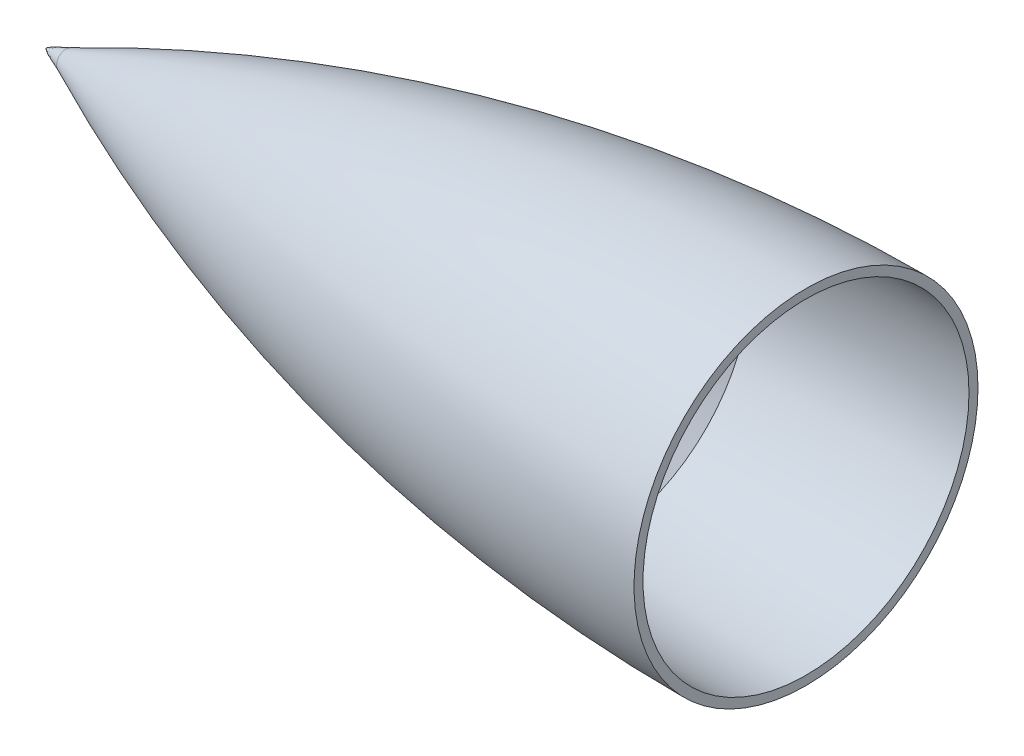
ISO-10303-21;
HEADER;
FILE_DESCRIPTION(('STEP AP214'),'2;1');
FILE_NAME('part.step','',(''),(''),'','','');
FILE_SCHEMA(('AUTOMOTIVE_DESIGN { 1 0 10303 214 1 1 1 1 }'));
ENDSEC;
DATA;
#1=APPLICATION_CONTEXT('core data for automotive mechanical design processes');
#2=APPLICATION_PROTOCOL_DEFINITION('international standard','automotive_design',2000,#1);
#3=PRODUCT_CONTEXT('',#1,'mechanical');
#4=PRODUCT('Part','Part','',(#3));
#5=PRODUCT_RELATED_PRODUCT_CATEGORY('part','',(#4));
#6=PRODUCT_DEFINITION_FORMATION('','',#4);
#7=PRODUCT_DEFINITION_CONTEXT('part definition',#1,'design');
#8=PRODUCT_DEFINITION('design','',#6,#7);
#9=PRODUCT_DEFINITION_SHAPE('','',#8);
#10=(LENGTH_UNIT() NAMED_UNIT(*) SI_UNIT(.MILLI.,.METRE.));
#11=(NAMED_UNIT(*) PLANE_ANGLE_UNIT() SI_UNIT($,.RADIAN.));
#12=(NAMED_UNIT(*) SI_UNIT($,.STERADIAN.) SOLID_ANGLE_UNIT());
#13=UNCERTAINTY_MEASURE_WITH_UNIT(LENGTH_MEASURE(1.E-05),#10,'distance_accuracy_value','');
#14=(GEOMETRIC_REPRESENTATION_CONTEXT(3) GLOBAL_UNCERTAINTY_ASSIGNED_CONTEXT((#13)) GLOBAL_UNIT_ASSIGNED_CONTEXT((#10,
#11,#12)) REPRESENTATION_CONTEXT('',''));
#15=CARTESIAN_POINT('',(0.,0.,0.));
#16=DIRECTION('',(0.,0.,1.));
#17=DIRECTION('',(1.,0.,0.));
#18=AXIS2_PLACEMENT_3D('',#15,#16,#17);
#19=CARTESIAN_POINT('',(0.,398.267441860465,0.));
#20=DIRECTION('',(1.,0.,0.));
#21=DIRECTION('',(0.,0.,-1.));
#22=AXIS2_PLACEMENT_3D('',#19,#20,#21);
#23=DEGENERATE_TOROIDAL_SURFACE('',#22,398.267441860465,441.267441860465,.F.);
#24=CARTESIAN_POINT('',(0.,398.267441860465,0.));
#25=DIRECTION('',(1.,0.,0.));
#26=DIRECTION('',(0.,0.,-1.));
#27=AXIS2_PLACEMENT_3D('',#24,#25,#26);
#28=CIRCLE('',#27,43.);
#29=CARTESIAN_POINT('',(0.,398.267441860465,-43.));
#30=VERTEX_POINT('',#29);
#31=EDGE_CURVE('E63',#30,#30,#28,.T.);
#32=ORIENTED_EDGE('',*,*,#31,.F.);
#33=EDGE_LOOP('',(#32));
#34=FACE_BOUND('',#33,.T.);
#35=CARTESIAN_POINT('',(-185.,398.267441860465,0.));
#36=DIRECTION('',(-1.,0.,0.));
#37=DIRECTION('',(0.,-1.,0.));
#38=AXIS2_PLACEMENT_3D('',#35,#36,#37);
#39=CIRCLE('',#38,2.34703022720045);
#40=CARTESIAN_POINT('',(-185.,395.920411633264,0.));
#41=VERTEX_POINT('',#40);
#42=EDGE_CURVE('E61',#41,#41,#39,.T.);
#43=ORIENTED_EDGE('',*,*,#42,.F.);
#44=EDGE_LOOP('',(#43));
#45=FACE_BOUND('',#44,.T.);
#46=ADVANCED_FACE('F41',(#34,#45),#23,.F.);
#47=CARTESIAN_POINT('',(0.,398.267441860465,398.267441860465));
#48=DIRECTION('',(0.,-1.,0.));
#49=DIRECTION('',(0.,0.,-1.));
#50=AXIS2_PLACEMENT_3D('',#47,#48,#49);
#51=CIRCLE('',#50,436.267441860465);
#52=TRIMMED_CURVE('',#51,(PARAMETER_VALUE(-0.420469330632792)),
(PARAMETER_VALUE(0.420469330632792)),.T.,.PARAMETER.);
#53=CARTESIAN_POINT('',(0.,398.267441860465,0.));
#54=DIRECTION('',(1.,0.,0.));
#55=AXIS1_PLACEMENT('',#53,#54);
#56=SURFACE_OF_REVOLUTION('',#52,#55);
#57=CARTESIAN_POINT('',(-54.8722186320111,398.267441860465,0.));
#58=DIRECTION('',(1.,0.,0.));
#59=DIRECTION('',(0.,0.,-1.));
#60=AXIS2_PLACEMENT_3D('',#57,#58,#59);
#61=CIRCLE('',#60,34.5354237144697);
#62=CARTESIAN_POINT('',(-54.8722186320111,398.267441860465,-34.5354237144697));
#63=VERTEX_POINT('',#62);
#64=EDGE_CURVE('E11',#63,#63,#61,.T.);
#65=ORIENTED_EDGE('',*,*,#64,.T.);
#66=EDGE_LOOP('',(#65));
#67=FACE_BOUND('',#66,.T.);
#68=CARTESIAN_POINT('',(-178.079548464711,398.267441860465,0.));
#69=VERTEX_POINT('',#68);
#70=VERTEX_LOOP('',#69);
#71=FACE_BOUND('',#70,.T.);
#72=ADVANCED_FACE('F90',(#67,#71),#56,.F.);
#73=CARTESIAN_POINT('',(-54.8722186320111,398.267441860465,0.));
#74=DIRECTION('',(1.,0.,0.));
#75=DIRECTION('',(0.,0.,-1.));
#76=AXIS2_PLACEMENT_3D('',#73,#74,#75);
#77=CONICAL_SURFACE('',#76,34.5354237144697,0.785398163397422);
#78=CARTESIAN_POINT('',(-51.7141177383253,398.267441860465,0.));
#79=DIRECTION('',(1.,0.,0.));
#80=DIRECTION('',(0.,0.,-1.));
#81=AXIS2_PLACEMENT_3D('',#78,#79,#80);
#82=CIRCLE('',#81,37.6935246081553);
#83=CARTESIAN_POINT('',(-51.7141177383253,398.267441860465,-37.6935246081553));
#84=VERTEX_POINT('',#83);
#85=EDGE_CURVE('E48',#84,#84,#82,.T.);
#86=ORIENTED_EDGE('',*,*,#85,.T.);
#87=EDGE_LOOP('',(#86));
#88=FACE_BOUND('',#87,.T.);
#89=ORIENTED_EDGE('',*,*,#64,.F.);
#90=EDGE_LOOP('',(#89));
#91=FACE_BOUND('',#90,.T.);
#92=ADVANCED_FACE('F77',(#88,#91),#77,.F.);
#93=CARTESIAN_POINT('',(0.,398.267441860465,0.));
#94=DIRECTION('',(1.,0.,0.));
#95=DIRECTION('',(0.,0.,-1.));
#96=AXIS2_PLACEMENT_3D('',#93,#94,#95);
#97=DEGENERATE_TOROIDAL_SURFACE('',#96,398.267441860465,439.017441860465,.F.);
#98=CARTESIAN_POINT('',(0.,398.267441860465,0.));
#99=DIRECTION('',(1.,0.,0.));
#100=DIRECTION('',(0.,0.,-1.));
#101=AXIS2_PLACEMENT_3D('',#98,#99,#100);
#102=CIRCLE('',#101,40.7500000000001);
#103=CARTESIAN_POINT('',(0.,398.267441860465,-40.7500000000001));
#104=VERTEX_POINT('',#103);
#105=EDGE_CURVE('E66',#104,#104,#102,.T.);
#106=ORIENTED_EDGE('',*,*,#105,.T.);
#107=EDGE_LOOP('',(#106));
#108=FACE_BOUND('',#107,.T.);
#109=ORIENTED_EDGE('',*,*,#85,.F.);
#110=EDGE_LOOP('',(#109));
#111=FACE_BOUND('',#110,.T.);
#112=ADVANCED_FACE('F80',(#108,#111),#97,.T.);
#113=CARTESIAN_POINT('',(0.,441.267441860465,0.));
#114=DIRECTION('',(1.,0.,0.));
#115=DIRECTION('',(0.,0.,-1.));
#116=AXIS2_PLACEMENT_3D('',#113,#114,#115);
#117=PLANE('',#116);
#118=ORIENTED_EDGE('',*,*,#31,.T.);
#119=EDGE_LOOP('',(#118));
#120=FACE_BOUND('',#119,.T.);
#121=ORIENTED_EDGE('',*,*,#105,.F.);
#122=EDGE_LOOP('',(#121));
#123=FACE_BOUND('',#122,.T.);
#124=ADVANCED_FACE('F57',(#120,#123),#117,.T.);
#125=CARTESIAN_POINT('',(-185.,400.614472087665,0.));
#126=CARTESIAN_POINT('',(-186.994315070824,399.772437375157,0.));
#127=CARTESIAN_POINT('',(-189.334509224748,399.05906875814,0.));
#128=CARTESIAN_POINT('',(-189.991001922598,398.267441860465,0.));
#129=B_SPLINE_CURVE_WITH_KNOTS('',3,(#125,#126,#127,#128),.UNSPECIFIED.,.F.,.F.,(4,4),(0.,1.),.UNSPECIFIED.);
#130=CARTESIAN_POINT('',(-185.,398.267441860465,0.));
#131=DIRECTION('',(1.,0.,0.));
#132=AXIS1_PLACEMENT('',#130,#131);
#133=SURFACE_OF_REVOLUTION('',#129,#132);
#134=CARTESIAN_POINT('',(-189.991001922598,398.267441860465,0.));
#135=VERTEX_POINT('',#134);
#136=VERTEX_LOOP('',#135);
#137=FACE_BOUND('',#136,.T.);
#138=ORIENTED_EDGE('',*,*,#42,.T.);
#139=EDGE_LOOP('',(#138));
#140=FACE_BOUND('',#139,.T.);
#141=ADVANCED_FACE('F54',(#137,#140),#133,.F.);
#142=CLOSED_SHELL('',(#46,#72,#92,#112,#124,#141));
#143=MANIFOLD_SOLID_BREP('B2',#142);
#144=ADVANCED_BREP_SHAPE_REPRESENTATION('',(#18,#143),#14);
#145=SHAPE_DEFINITION_REPRESENTATION(#9,#144);
ENDSEC;
END-ISO-10303-21;
